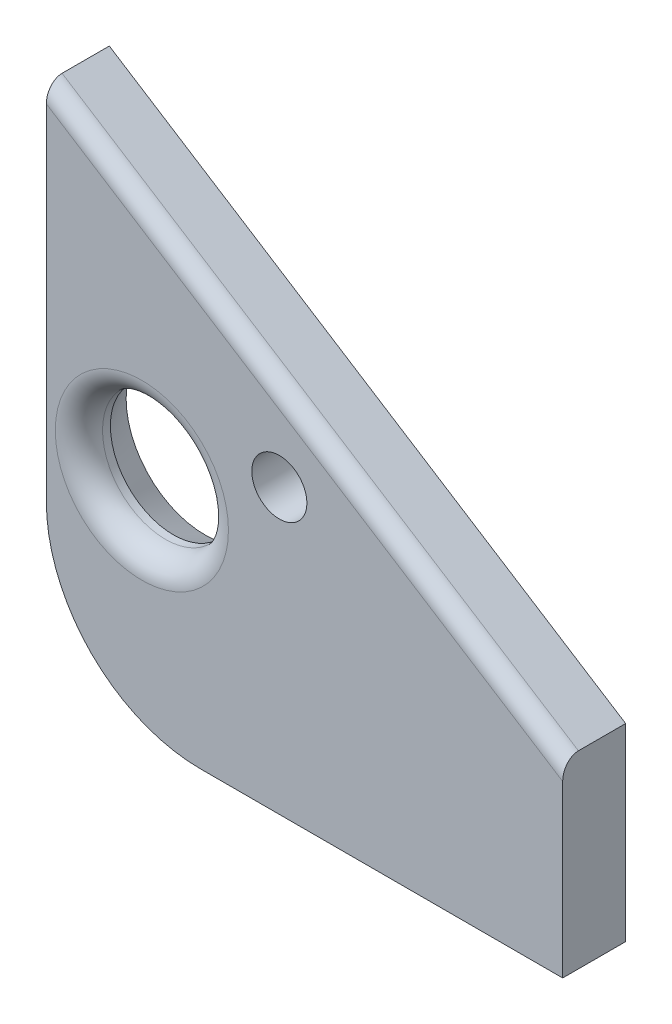
ISO-10303-21;
HEADER;
FILE_DESCRIPTION(('STEP AP214'),'2;1');
FILE_NAME('part.step','',(''),(''),'','','');
FILE_SCHEMA(('AUTOMOTIVE_DESIGN { 1 0 10303 214 1 1 1 1 }'));
ENDSEC;
DATA;
#1=APPLICATION_CONTEXT('core data for automotive mechanical design processes');
#2=APPLICATION_PROTOCOL_DEFINITION('international standard','automotive_design',2000,#1);
#3=PRODUCT_CONTEXT('',#1,'mechanical');
#4=PRODUCT('Part','Part','',(#3));
#5=PRODUCT_RELATED_PRODUCT_CATEGORY('part','',(#4));
#6=PRODUCT_DEFINITION_FORMATION('','',#4);
#7=PRODUCT_DEFINITION_CONTEXT('part definition',#1,'design');
#8=PRODUCT_DEFINITION('design','',#6,#7);
#9=PRODUCT_DEFINITION_SHAPE('','',#8);
#10=(LENGTH_UNIT() NAMED_UNIT(*) SI_UNIT(.MILLI.,.METRE.));
#11=(NAMED_UNIT(*) PLANE_ANGLE_UNIT() SI_UNIT($,.RADIAN.));
#12=(NAMED_UNIT(*) SI_UNIT($,.STERADIAN.) SOLID_ANGLE_UNIT());
#13=UNCERTAINTY_MEASURE_WITH_UNIT(LENGTH_MEASURE(1.E-05),#10,'distance_accuracy_value','');
#14=(GEOMETRIC_REPRESENTATION_CONTEXT(3) GLOBAL_UNCERTAINTY_ASSIGNED_CONTEXT((#13)) GLOBAL_UNIT_ASSIGNED_CONTEXT((#10,
#11,#12)) REPRESENTATION_CONTEXT('',''));
#15=CARTESIAN_POINT('',(0.,0.,0.));
#16=DIRECTION('',(0.,0.,1.));
#17=DIRECTION('',(1.,0.,0.));
#18=AXIS2_PLACEMENT_3D('',#15,#16,#17);
#19=CARTESIAN_POINT('',(30.,-120.,45.5));
#20=DIRECTION('',(0.,0.,1.));
#21=DIRECTION('',(-1.,0.,0.));
#22=AXIS2_PLACEMENT_3D('',#19,#20,#21);
#23=CYLINDRICAL_SURFACE('',#22,9.8);
#24=CARTESIAN_POINT('',(30.,-120.,45.5));
#25=DIRECTION('',(0.,0.,1.));
#26=DIRECTION('',(-1.,0.,0.));
#27=AXIS2_PLACEMENT_3D('',#24,#25,#26);
#28=CIRCLE('',#27,9.8);
#29=CARTESIAN_POINT('',(20.2,-120.,45.5));
#30=VERTEX_POINT('',#29);
#31=CARTESIAN_POINT('',(30.,-129.8,45.5));
#32=VERTEX_POINT('',#31);
#33=EDGE_CURVE('E207',#30,#32,#28,.T.);
#34=ORIENTED_EDGE('',*,*,#33,.T.);
#35=DIRECTION('',(0.,0.,1.));
#36=VECTOR('',#35,1.);
#37=CARTESIAN_POINT('',(30.,-129.8,45.5));
#38=LINE('',#37,#36);
#39=CARTESIAN_POINT('',(30.,-129.8,49.5));
#40=VERTEX_POINT('',#39);
#41=EDGE_CURVE('E11',#32,#40,#38,.T.);
#42=ORIENTED_EDGE('',*,*,#41,.T.);
#43=CARTESIAN_POINT('',(30.,-120.,49.5));
#44=DIRECTION('',(0.,0.,1.));
#45=DIRECTION('',(-1.,0.,0.));
#46=AXIS2_PLACEMENT_3D('',#43,#44,#45);
#47=CIRCLE('',#46,9.8);
#48=CARTESIAN_POINT('',(20.2,-120.,49.5));
#49=VERTEX_POINT('',#48);
#50=EDGE_CURVE('E421',#49,#40,#47,.T.);
#51=ORIENTED_EDGE('',*,*,#50,.F.);
#52=DIRECTION('',(0.,0.,1.));
#53=VECTOR('',#52,1.);
#54=CARTESIAN_POINT('',(20.2,-120.,45.5));
#55=LINE('',#54,#53);
#56=EDGE_CURVE('E215',#30,#49,#55,.T.);
#57=ORIENTED_EDGE('',*,*,#56,.F.);
#58=EDGE_LOOP('',(#34,#42,#51,#57));
#59=FACE_BOUND('',#58,.T.);
#60=ADVANCED_FACE('F17',(#59),#23,.T.);
#61=CARTESIAN_POINT('',(30.,-129.8,45.5));
#62=DIRECTION('',(0.,-1.,0.));
#63=DIRECTION('',(0.,0.,-1.));
#64=AXIS2_PLACEMENT_3D('',#61,#62,#63);
#65=PLANE('',#64);
#66=DIRECTION('',(1.,0.,0.));
#67=VECTOR('',#66,1.);
#68=CARTESIAN_POINT('',(-20.,-129.8,45.5));
#69=LINE('',#68,#67);
#70=CARTESIAN_POINT('',(53.0000007897615,-129.8,45.5));
#71=VERTEX_POINT('',#70);
#72=EDGE_CURVE('E169',#32,#71,#69,.T.);
#73=ORIENTED_EDGE('',*,*,#72,.T.);
#74=DIRECTION('',(0.,0.,1.));
#75=VECTOR('',#74,1.);
#76=CARTESIAN_POINT('',(53.0000007897615,-129.8,45.5));
#77=LINE('',#76,#75);
#78=CARTESIAN_POINT('',(53.0000007897615,-129.8,49.5));
#79=VERTEX_POINT('',#78);
#80=EDGE_CURVE('E28',#71,#79,#77,.T.);
#81=ORIENTED_EDGE('',*,*,#80,.T.);
#82=DIRECTION('',(1.,0.,0.));
#83=VECTOR('',#82,1.);
#84=CARTESIAN_POINT('',(-20.,-129.8,49.5));
#85=LINE('',#84,#83);
#86=EDGE_CURVE('E191',#40,#79,#85,.T.);
#87=ORIENTED_EDGE('',*,*,#86,.F.);
#88=ORIENTED_EDGE('',*,*,#41,.F.);
#89=EDGE_LOOP('',(#73,#81,#87,#88));
#90=FACE_BOUND('',#89,.T.);
#91=ADVANCED_FACE('F359',(#90),#65,.T.);
#92=CARTESIAN_POINT('',(53.0000007897615,-129.8,45.5));
#93=DIRECTION('',(1.,0.,0.));
#94=DIRECTION('',(0.,-1.,0.));
#95=AXIS2_PLACEMENT_3D('',#92,#93,#94);
#96=PLANE('',#95);
#97=CARTESIAN_POINT('',(53.0000007897616,-118.985309520043,48.5));
#98=DIRECTION('',(-1.,0.,0.));
#99=DIRECTION('',(0.,1.,0.));
#100=AXIS2_PLACEMENT_3D('',#97,#98,#99);
#101=ELLIPSE('',#100,1.18530952004229,1.);
#102=CARTESIAN_POINT('',(53.0000007897616,-118.985309520043,49.5));
#103=VERTEX_POINT('',#102);
#104=CARTESIAN_POINT('',(53.0000007897616,-117.8,48.5));
#105=VERTEX_POINT('',#104);
#106=EDGE_CURVE('E192',#103,#105,#101,.T.);
#107=ORIENTED_EDGE('',*,*,#106,.F.);
#108=DIRECTION('',(0.,1.,0.));
#109=VECTOR('',#108,1.);
#110=CARTESIAN_POINT('',(53.0000007897616,-117.8,49.5));
#111=LINE('',#110,#109);
#112=EDGE_CURVE('E186',#79,#103,#111,.T.);
#113=ORIENTED_EDGE('',*,*,#112,.F.);
#114=ORIENTED_EDGE('',*,*,#80,.F.);
#115=DIRECTION('',(0.,-1.,0.));
#116=VECTOR('',#115,1.);
#117=CARTESIAN_POINT('',(53.0000007897616,-117.8,45.5));
#118=LINE('',#117,#116);
#119=CARTESIAN_POINT('',(53.0000007897616,-117.8,45.5));
#120=VERTEX_POINT('',#119);
#121=EDGE_CURVE('E166',#120,#71,#118,.T.);
#122=ORIENTED_EDGE('',*,*,#121,.F.);
#123=DIRECTION('',(0.,0.,1.));
#124=VECTOR('',#123,1.);
#125=CARTESIAN_POINT('',(53.0000007897616,-117.8,45.5));
#126=LINE('',#125,#124);
#127=EDGE_CURVE('E42',#120,#105,#126,.T.);
#128=ORIENTED_EDGE('',*,*,#127,.T.);
#129=EDGE_LOOP('',(#107,#113,#114,#122,#128));
#130=FACE_BOUND('',#129,.T.);
#131=ADVANCED_FACE('F351',(#130),#96,.T.);
#132=CARTESIAN_POINT('',(53.0000007897616,-117.8,45.5));
#133=DIRECTION('',(0.536875483047984,0.843661493551765,0.));
#134=DIRECTION('',(0.,0.,-1.));
#135=AXIS2_PLACEMENT_3D('',#132,#133,#134);
#136=PLANE('',#135);
#137=DIRECTION('',(-0.843661493551765,0.536875483047984,0.));
#138=VECTOR('',#137,1.);
#139=CARTESIAN_POINT('',(46.1588241079599,-113.446524033951,48.5));
#140=LINE('',#139,#138);
#141=CARTESIAN_POINT('',(20.2,-96.9272727242271,48.5));
#142=VERTEX_POINT('',#141);
#143=EDGE_CURVE('E196',#105,#142,#140,.T.);
#144=ORIENTED_EDGE('',*,*,#143,.F.);
#145=ORIENTED_EDGE('',*,*,#127,.F.);
#146=DIRECTION('',(-0.843661493551765,0.536875483047984,0.));
#147=VECTOR('',#146,1.);
#148=CARTESIAN_POINT('',(53.0000007897616,-117.8,45.5));
#149=LINE('',#148,#147);
#150=CARTESIAN_POINT('',(20.2,-96.9272727242271,45.5));
#151=VERTEX_POINT('',#150);
#152=EDGE_CURVE('E170',#120,#151,#149,.T.);
#153=ORIENTED_EDGE('',*,*,#152,.T.);
#154=DIRECTION('',(0.,0.,1.));
#155=VECTOR('',#154,1.);
#156=CARTESIAN_POINT('',(20.2,-96.9272727242271,45.5));
#157=LINE('',#156,#155);
#158=EDGE_CURVE('E77',#151,#142,#157,.T.);
#159=ORIENTED_EDGE('',*,*,#158,.T.);
#160=EDGE_LOOP('',(#144,#145,#153,#159));
#161=FACE_BOUND('',#160,.T.);
#162=ADVANCED_FACE('F343',(#161),#136,.T.);
#163=CARTESIAN_POINT('',(20.2,-96.9272727242271,45.5));
#164=DIRECTION('',(-1.,0.,0.));
#165=DIRECTION('',(0.,0.,1.));
#166=AXIS2_PLACEMENT_3D('',#163,#164,#165);
#167=PLANE('',#166);
#168=CARTESIAN_POINT('',(20.2,-98.1125822442694,48.5));
#169=DIRECTION('',(1.,0.,0.));
#170=DIRECTION('',(0.,1.,0.));
#171=AXIS2_PLACEMENT_3D('',#168,#169,#170);
#172=ELLIPSE('',#171,1.18530952004229,1.);
#173=CARTESIAN_POINT('',(20.2,-98.1125822442694,49.5));
#174=VERTEX_POINT('',#173);
#175=EDGE_CURVE('E159',#142,#174,#172,.T.);
#176=ORIENTED_EDGE('',*,*,#175,.F.);
#177=ORIENTED_EDGE('',*,*,#158,.F.);
#178=DIRECTION('',(0.,-1.,0.));
#179=VECTOR('',#178,1.);
#180=CARTESIAN_POINT('',(20.2,-96.9272727242271,45.5));
#181=LINE('',#180,#179);
#182=EDGE_CURVE('E205',#151,#30,#181,.T.);
#183=ORIENTED_EDGE('',*,*,#182,.T.);
#184=ORIENTED_EDGE('',*,*,#56,.T.);
#185=DIRECTION('',(0.,-1.,0.));
#186=VECTOR('',#185,1.);
#187=CARTESIAN_POINT('',(20.2,-96.9272727242271,49.5));
#188=LINE('',#187,#186);
#189=EDGE_CURVE('E425',#174,#49,#188,.T.);
#190=ORIENTED_EDGE('',*,*,#189,.F.);
#191=EDGE_LOOP('',(#176,#177,#183,#184,#190));
#192=FACE_BOUND('',#191,.T.);
#193=ADVANCED_FACE('F333',(#192),#167,.T.);
#194=CARTESIAN_POINT('',(45.6219486249119,-114.290185527503,48.5));
#195=DIRECTION('',(-0.843661493551763,0.536875483047986,0.));
#196=DIRECTION('',(0.379628294716037,0.596558763116423,0.707106781186545));
#197=AXIS2_PLACEMENT_3D('',#194,#195,#196);
#198=CYLINDRICAL_SURFACE('',#197,1.);
#199=ORIENTED_EDGE('',*,*,#175,.T.);
#200=DIRECTION('',(0.843661493551765,-0.536875483047984,0.));
#201=VECTOR('',#200,1.);
#202=CARTESIAN_POINT('',(45.6219486249119,-114.290185527503,49.5));
#203=LINE('',#202,#201);
#204=EDGE_CURVE('E431',#174,#103,#203,.T.);
#205=ORIENTED_EDGE('',*,*,#204,.T.);
#206=ORIENTED_EDGE('',*,*,#106,.T.);
#207=ORIENTED_EDGE('',*,*,#143,.T.);
#208=EDGE_LOOP('',(#199,#205,#206,#207));
#209=FACE_BOUND('',#208,.T.);
#210=ADVANCED_FACE('F325',(#209),#198,.T.);
#211=CARTESIAN_POINT('',(35.0000007897616,-111.8,45.5));
#212=DIRECTION('',(0.,0.,1.));
#213=DIRECTION('',(1.,0.,0.));
#214=AXIS2_PLACEMENT_3D('',#211,#212,#213);
#215=CYLINDRICAL_SURFACE('',#214,1.75);
#216=CARTESIAN_POINT('',(35.0000007897616,-111.8,45.5));
#217=DIRECTION('',(0.,0.,1.));
#218=DIRECTION('',(1.,0.,0.));
#219=AXIS2_PLACEMENT_3D('',#216,#217,#218);
#220=CIRCLE('',#219,1.75);
#221=CARTESIAN_POINT('',(33.2500007897616,-111.8,45.5));
#222=VERTEX_POINT('',#221);
#223=EDGE_CURVE('E185',#222,#222,#220,.T.);
#224=ORIENTED_EDGE('',*,*,#223,.F.);
#225=DIRECTION('',(0.,0.,1.));
#226=VECTOR('',#225,1.);
#227=CARTESIAN_POINT('',(33.2500007897616,-111.8,45.5));
#228=LINE('',#227,#226);
#229=CARTESIAN_POINT('',(33.2500007897616,-111.8,49.5));
#230=VERTEX_POINT('',#229);
#231=EDGE_CURVE('E152',#222,#230,#228,.T.);
#232=ORIENTED_EDGE('',*,*,#231,.T.);
#233=CARTESIAN_POINT('',(35.0000007897616,-111.8,49.5));
#234=DIRECTION('',(0.,0.,-1.));
#235=DIRECTION('',(1.,0.,0.));
#236=AXIS2_PLACEMENT_3D('',#233,#234,#235);
#237=CIRCLE('',#236,1.75);
#238=EDGE_CURVE('E190',#230,#230,#237,.T.);
#239=ORIENTED_EDGE('',*,*,#238,.F.);
#240=ORIENTED_EDGE('',*,*,#231,.F.);
#241=EDGE_LOOP('',(#224,#232,#239,#240));
#242=FACE_BOUND('',#241,.T.);
#243=ADVANCED_FACE('F19',(#242),#215,.F.);
#244=CARTESIAN_POINT('',(27.0000004023314,-125.000001862645,48.));
#245=DIRECTION('',(0.,0.,1.));
#246=DIRECTION('',(1.,0.,0.));
#247=AXIS2_PLACEMENT_3D('',#244,#245,#246);
#248=PLANE('',#247);
#249=CARTESIAN_POINT('',(27.0000004023314,-125.000001862645,48.));
#250=DIRECTION('',(0.,0.,1.));
#251=DIRECTION('',(1.,0.,0.));
#252=AXIS2_PLACEMENT_3D('',#249,#250,#251);
#253=CIRCLE('',#252,1.05);
#254=CARTESIAN_POINT('',(25.9500004023314,-125.000001862645,48.));
#255=VERTEX_POINT('',#254);
#256=EDGE_CURVE('E145',#255,#255,#253,.T.);
#257=ORIENTED_EDGE('',*,*,#256,.F.);
#258=EDGE_LOOP('',(#257));
#259=FACE_BOUND('',#258,.T.);
#260=ADVANCED_FACE('F306',(#259),#248,.F.);
#261=CARTESIAN_POINT('',(27.0000004023314,-125.000001862645,45.5));
#262=DIRECTION('',(0.,0.,1.));
#263=DIRECTION('',(1.,0.,0.));
#264=AXIS2_PLACEMENT_3D('',#261,#262,#263);
#265=CYLINDRICAL_SURFACE('',#264,1.05);
#266=CARTESIAN_POINT('',(27.0000004023314,-125.000001862645,45.5));
#267=DIRECTION('',(0.,0.,1.));
#268=DIRECTION('',(1.,0.,0.));
#269=AXIS2_PLACEMENT_3D('',#266,#267,#268);
#270=CIRCLE('',#269,1.05);
#271=CARTESIAN_POINT('',(25.9500004023314,-125.000001862645,45.5));
#272=VERTEX_POINT('',#271);
#273=EDGE_CURVE('E161',#272,#272,#270,.T.);
#274=ORIENTED_EDGE('',*,*,#273,.F.);
#275=DIRECTION('',(0.,0.,1.));
#276=VECTOR('',#275,1.);
#277=CARTESIAN_POINT('',(25.9500004023314,-125.000001862645,45.5));
#278=LINE('',#277,#276);
#279=EDGE_CURVE('E148',#272,#255,#278,.T.);
#280=ORIENTED_EDGE('',*,*,#279,.T.);
#281=ORIENTED_EDGE('',*,*,#256,.T.);
#282=ORIENTED_EDGE('',*,*,#279,.F.);
#283=EDGE_LOOP('',(#274,#280,#281,#282));
#284=FACE_BOUND('',#283,.T.);
#285=ADVANCED_FACE('F147',(#284),#265,.F.);
#286=CARTESIAN_POINT('',(36.6000003948808,-113.363636362114,45.5));
#287=DIRECTION('',(0.,0.,1.));
#288=DIRECTION('',(1.,0.,0.));
#289=AXIS2_PLACEMENT_3D('',#286,#287,#288);
#290=PLANE('',#289);
#291=CARTESIAN_POINT('',(26.268219927732,-115.78643209227,45.5));
#292=DIRECTION('',(0.,0.,-1.));
#293=DIRECTION('',(1.,0.,0.));
#294=AXIS2_PLACEMENT_3D('',#291,#292,#293);
#295=CIRCLE('',#294,5.);
#296=CARTESIAN_POINT('',(21.268219927732,-115.78643209227,45.5));
#297=VERTEX_POINT('',#296);
#298=EDGE_CURVE('E206',#297,#297,#295,.T.);
#299=ORIENTED_EDGE('',*,*,#298,.F.);
#300=EDGE_LOOP('',(#299));
#301=FACE_BOUND('',#300,.T.);
#302=ORIENTED_EDGE('',*,*,#273,.T.);
#303=EDGE_LOOP('',(#302));
#304=FACE_BOUND('',#303,.T.);
#305=ORIENTED_EDGE('',*,*,#223,.T.);
#306=EDGE_LOOP('',(#305));
#307=FACE_BOUND('',#306,.T.);
#308=ORIENTED_EDGE('',*,*,#182,.F.);
#309=ORIENTED_EDGE('',*,*,#152,.F.);
#310=ORIENTED_EDGE('',*,*,#121,.T.);
#311=ORIENTED_EDGE('',*,*,#72,.F.);
#312=ORIENTED_EDGE('',*,*,#33,.F.);
#313=EDGE_LOOP('',(#308,#309,#310,#311,#312));
#314=FACE_BOUND('',#313,.T.);
#315=ADVANCED_FACE('F289',(#301,#304,#307,#314),#290,.F.);
#316=CARTESIAN_POINT('',(26.268219927732,-115.78643209227,46.5));
#317=DIRECTION('',(0.,0.,-1.));
#318=DIRECTION('',(1.,0.,0.));
#319=AXIS2_PLACEMENT_3D('',#316,#317,#318);
#320=CONICAL_SURFACE('',#319,4.5,0.463647609000806);
#321=ORIENTED_EDGE('',*,*,#298,.T.);
#322=DIRECTION('',(0.447213595499958,0.,0.894427190999916));
#323=VECTOR('',#322,1.);
#324=CARTESIAN_POINT('',(21.768219927732,-115.78643209227,46.5));
#325=LINE('',#324,#323);
#326=CARTESIAN_POINT('',(22.268219927732,-115.78643209227,47.5));
#327=VERTEX_POINT('',#326);
#328=EDGE_CURVE('E92',#297,#327,#325,.T.);
#329=ORIENTED_EDGE('',*,*,#328,.T.);
#330=CARTESIAN_POINT('',(26.268219927732,-115.78643209227,47.5));
#331=DIRECTION('',(0.,0.,1.));
#332=DIRECTION('',(1.,0.,0.));
#333=AXIS2_PLACEMENT_3D('',#330,#331,#332);
#334=CIRCLE('',#333,4.);
#335=EDGE_CURVE('E182',#327,#327,#334,.T.);
#336=ORIENTED_EDGE('',*,*,#335,.T.);
#337=ORIENTED_EDGE('',*,*,#328,.F.);
#338=EDGE_LOOP('',(#321,#329,#336,#337));
#339=FACE_BOUND('',#338,.T.);
#340=ADVANCED_FACE('F278',(#339),#320,.F.);
#341=CARTESIAN_POINT('',(36.6000003948808,-113.363636362114,49.5));
#342=DIRECTION('',(0.,0.,1.));
#343=DIRECTION('',(1.,0.,0.));
#344=AXIS2_PLACEMENT_3D('',#341,#342,#343);
#345=PLANE('',#344);
#346=CARTESIAN_POINT('',(26.268219927732,-115.78643209227,49.5));
#347=DIRECTION('',(0.,0.,1.));
#348=DIRECTION('',(1.,0.,0.));
#349=AXIS2_PLACEMENT_3D('',#346,#347,#348);
#350=CIRCLE('',#349,5.5);
#351=CARTESIAN_POINT('',(20.768219927732,-115.78643209227,49.5));
#352=VERTEX_POINT('',#351);
#353=CARTESIAN_POINT('',(31.768219927732,-115.78643209227,49.5));
#354=VERTEX_POINT('',#353);
#355=EDGE_CURVE('E176',#352,#354,#350,.T.);
#356=ORIENTED_EDGE('',*,*,#355,.F.);
#357=CARTESIAN_POINT('',(26.268219927732,-115.78643209227,49.5));
#358=DIRECTION('',(0.,0.,1.));
#359=DIRECTION('',(1.,0.,0.));
#360=AXIS2_PLACEMENT_3D('',#357,#358,#359);
#361=CIRCLE('',#360,5.5);
#362=EDGE_CURVE('E179',#354,#352,#361,.T.);
#363=ORIENTED_EDGE('',*,*,#362,.F.);
#364=EDGE_LOOP('',(#356,#363));
#365=FACE_BOUND('',#364,.T.);
#366=ORIENTED_EDGE('',*,*,#238,.T.);
#367=EDGE_LOOP('',(#366));
#368=FACE_BOUND('',#367,.T.);
#369=ORIENTED_EDGE('',*,*,#204,.F.);
#370=ORIENTED_EDGE('',*,*,#189,.T.);
#371=ORIENTED_EDGE('',*,*,#50,.T.);
#372=ORIENTED_EDGE('',*,*,#86,.T.);
#373=ORIENTED_EDGE('',*,*,#112,.T.);
#374=EDGE_LOOP('',(#369,#370,#371,#372,#373));
#375=FACE_BOUND('',#374,.T.);
#376=ADVANCED_FACE('F268',(#365,#368,#375),#345,.T.);
#377=CARTESIAN_POINT('',(26.268219927732,-115.78643209227,49.5));
#378=DIRECTION('',(0.,0.,-1.));
#379=DIRECTION('',(1.,0.,0.));
#380=AXIS2_PLACEMENT_3D('',#377,#378,#379);
#381=CYLINDRICAL_SURFACE('',#380,4.);
#382=CARTESIAN_POINT('',(26.268219927732,-115.78643209227,48.));
#383=DIRECTION('',(0.,0.,-1.));
#384=DIRECTION('',(1.,0.,0.));
#385=AXIS2_PLACEMENT_3D('',#382,#383,#384);
#386=CIRCLE('',#385,4.);
#387=CARTESIAN_POINT('',(22.268219927732,-115.78643209227,48.));
#388=VERTEX_POINT('',#387);
#389=CARTESIAN_POINT('',(30.268219927732,-115.78643209227,48.));
#390=VERTEX_POINT('',#389);
#391=EDGE_CURVE('E115',#388,#390,#386,.T.);
#392=ORIENTED_EDGE('',*,*,#391,.F.);
#393=DIRECTION('',(0.,0.,-1.));
#394=VECTOR('',#393,1.);
#395=CARTESIAN_POINT('',(22.268219927732,-115.78643209227,49.5));
#396=LINE('',#395,#394);
#397=EDGE_CURVE('E126',#388,#327,#396,.T.);
#398=ORIENTED_EDGE('',*,*,#397,.T.);
#399=ORIENTED_EDGE('',*,*,#335,.F.);
#400=ORIENTED_EDGE('',*,*,#397,.F.);
#401=CARTESIAN_POINT('',(26.268219927732,-115.78643209227,48.));
#402=DIRECTION('',(0.,0.,-1.));
#403=DIRECTION('',(1.,0.,0.));
#404=AXIS2_PLACEMENT_3D('',#401,#402,#403);
#405=CIRCLE('',#404,4.);
#406=EDGE_CURVE('E21',#390,#388,#405,.T.);
#407=ORIENTED_EDGE('',*,*,#406,.F.);
#408=EDGE_LOOP('',(#392,#398,#399,#400,#407));
#409=FACE_BOUND('',#408,.T.);
#410=ADVANCED_FACE('F256',(#409),#381,.F.);
#411=CARTESIAN_POINT('',(26.268219927732,-115.78643209227,48.));
#412=DIRECTION('',(0.,0.,-1.));
#413=DIRECTION('',(-1.,0.,0.));
#414=AXIS2_PLACEMENT_3D('',#411,#412,#413);
#415=TOROIDAL_SURFACE('',#414,5.5,1.5);
#416=ORIENTED_EDGE('',*,*,#355,.T.);
#417=CARTESIAN_POINT('',(31.768219927732,-115.78643209227,48.));
#418=DIRECTION('',(0.,-1.,0.));
#419=DIRECTION('',(1.,0.,0.));
#420=AXIS2_PLACEMENT_3D('',#417,#418,#419);
#421=CIRCLE('',#420,1.5);
#422=EDGE_CURVE('E172',#354,#390,#421,.T.);
#423=ORIENTED_EDGE('',*,*,#422,.T.);
#424=ORIENTED_EDGE('',*,*,#406,.T.);
#425=ORIENTED_EDGE('',*,*,#391,.T.);
#426=ORIENTED_EDGE('',*,*,#422,.F.);
#427=ORIENTED_EDGE('',*,*,#362,.T.);
#428=EDGE_LOOP('',(#416,#423,#424,#425,#426,#427));
#429=FACE_BOUND('',#428,.T.);
#430=ADVANCED_FACE('F250',(#429),#415,.T.);
#431=CLOSED_SHELL('',(#60,#91,#131,#162,#193,#210,#243,#260,#285,#315,#340,#376,#410,#430));
#432=MANIFOLD_SOLID_BREP('B1',#431);
#433=ADVANCED_BREP_SHAPE_REPRESENTATION('',(#18,#432),#14);
#434=SHAPE_DEFINITION_REPRESENTATION(#9,#433);
ENDSEC;
END-ISO-10303-21;
